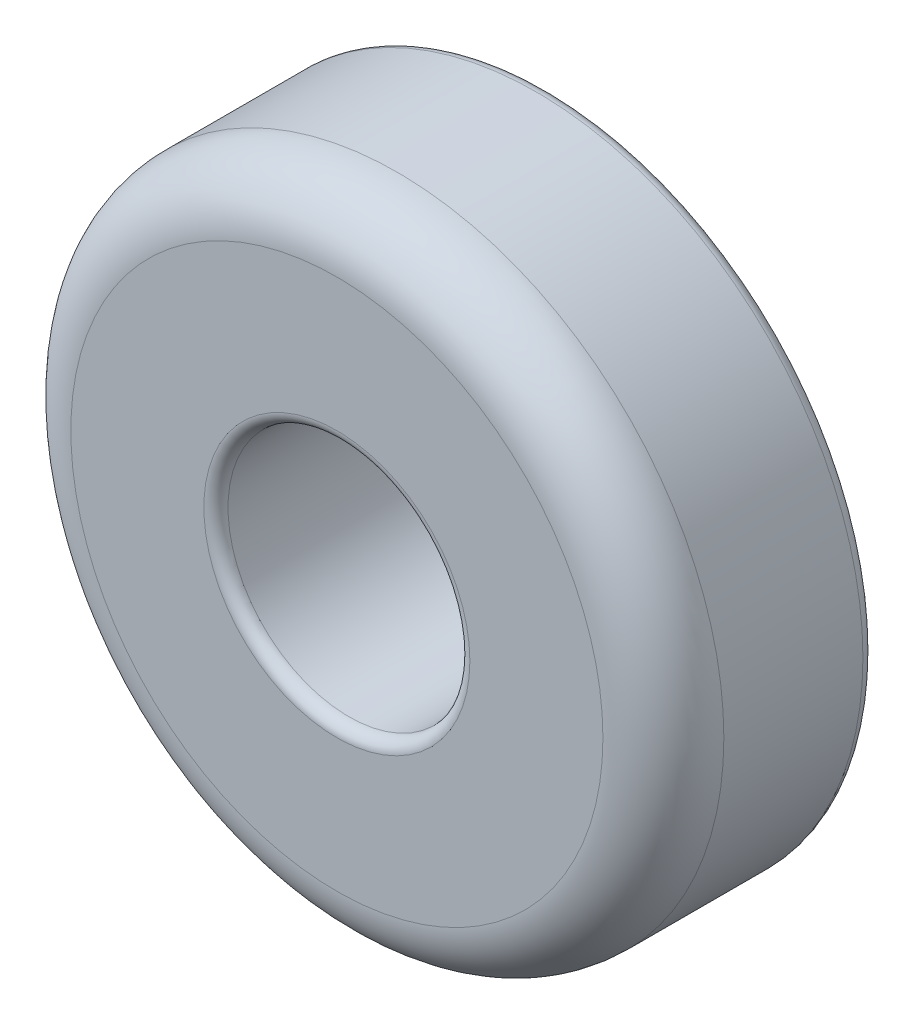
ISO-10303-21;
HEADER;
FILE_DESCRIPTION(('STEP AP214'),'2;1');
FILE_NAME('part.step','',(''),(''),'','','');
FILE_SCHEMA(('AUTOMOTIVE_DESIGN { 1 0 10303 214 1 1 1 1 }'));
ENDSEC;
DATA;
#1=APPLICATION_CONTEXT('core data for automotive mechanical design processes');
#2=APPLICATION_PROTOCOL_DEFINITION('international standard','automotive_design',2000,#1);
#3=PRODUCT_CONTEXT('',#1,'mechanical');
#4=PRODUCT('Part','Part','',(#3));
#5=PRODUCT_RELATED_PRODUCT_CATEGORY('part','',(#4));
#6=PRODUCT_DEFINITION_FORMATION('','',#4);
#7=PRODUCT_DEFINITION_CONTEXT('part definition',#1,'design');
#8=PRODUCT_DEFINITION('design','',#6,#7);
#9=PRODUCT_DEFINITION_SHAPE('','',#8);
#10=(LENGTH_UNIT() NAMED_UNIT(*) SI_UNIT(.MILLI.,.METRE.));
#11=(NAMED_UNIT(*) PLANE_ANGLE_UNIT() SI_UNIT($,.RADIAN.));
#12=(NAMED_UNIT(*) SI_UNIT($,.STERADIAN.) SOLID_ANGLE_UNIT());
#13=UNCERTAINTY_MEASURE_WITH_UNIT(LENGTH_MEASURE(1.E-05),#10,'distance_accuracy_value','');
#14=(GEOMETRIC_REPRESENTATION_CONTEXT(3) GLOBAL_UNCERTAINTY_ASSIGNED_CONTEXT((#13)) GLOBAL_UNIT_ASSIGNED_CONTEXT((#10,
#11,#12)) REPRESENTATION_CONTEXT('',''));
#15=CARTESIAN_POINT('',(0.,0.,0.));
#16=DIRECTION('',(0.,0.,1.));
#17=DIRECTION('',(1.,0.,0.));
#18=AXIS2_PLACEMENT_3D('',#15,#16,#17);
#19=CARTESIAN_POINT('',(0.,0.,1.75));
#20=DIRECTION('',(0.,0.,1.));
#21=DIRECTION('',(1.,0.,0.));
#22=AXIS2_PLACEMENT_3D('',#19,#20,#21);
#23=PLANE('',#22);
#24=CARTESIAN_POINT('',(0.,0.,1.75));
#25=DIRECTION('',(0.,0.,1.));
#26=DIRECTION('',(1.,0.,0.));
#27=AXIS2_PLACEMENT_3D('',#24,#25,#26);
#28=CIRCLE('',#27,1.1);
#29=CARTESIAN_POINT('',(1.1,0.,1.75));
#30=VERTEX_POINT('',#29);
#31=EDGE_CURVE('E47',#30,#30,#28,.F.);
#32=ORIENTED_EDGE('',*,*,#31,.T.);
#33=EDGE_LOOP('',(#32));
#34=FACE_BOUND('',#33,.T.);
#35=CARTESIAN_POINT('',(0.,0.,1.75));
#36=DIRECTION('',(0.,0.,1.));
#37=DIRECTION('',(1.,0.,0.));
#38=AXIS2_PLACEMENT_3D('',#35,#36,#37);
#39=CIRCLE('',#38,2.2);
#40=CARTESIAN_POINT('',(2.2,0.,1.75));
#41=VERTEX_POINT('',#40);
#42=EDGE_CURVE('E59',#41,#41,#39,.T.);
#43=ORIENTED_EDGE('',*,*,#42,.T.);
#44=EDGE_LOOP('',(#43));
#45=FACE_BOUND('',#44,.T.);
#46=ADVANCED_FACE('F36',(#34,#45),#23,.T.);
#47=CARTESIAN_POINT('',(0.,0.,0.));
#48=DIRECTION('',(0.,0.,1.));
#49=DIRECTION('',(1.,0.,0.));
#50=AXIS2_PLACEMENT_3D('',#47,#48,#49);
#51=PLANE('',#50);
#52=CARTESIAN_POINT('',(0.,0.,0.));
#53=DIRECTION('',(0.,0.,1.));
#54=DIRECTION('',(1.,0.,0.));
#55=AXIS2_PLACEMENT_3D('',#52,#53,#54);
#56=CIRCLE('',#55,2.6);
#57=CARTESIAN_POINT('',(2.6,0.,0.));
#58=VERTEX_POINT('',#57);
#59=EDGE_CURVE('E11',#58,#58,#56,.F.);
#60=ORIENTED_EDGE('',*,*,#59,.T.);
#61=EDGE_LOOP('',(#60));
#62=FACE_BOUND('',#61,.T.);
#63=CARTESIAN_POINT('',(0.,0.,0.));
#64=DIRECTION('',(0.,0.,1.));
#65=DIRECTION('',(1.,0.,0.));
#66=AXIS2_PLACEMENT_3D('',#63,#64,#65);
#67=CIRCLE('',#66,1.);
#68=CARTESIAN_POINT('',(1.,0.,0.));
#69=VERTEX_POINT('',#68);
#70=EDGE_CURVE('E62',#69,#69,#67,.T.);
#71=ORIENTED_EDGE('',*,*,#70,.T.);
#72=EDGE_LOOP('',(#71));
#73=FACE_BOUND('',#72,.T.);
#74=ADVANCED_FACE('F66',(#62,#73),#51,.F.);
#75=CARTESIAN_POINT('',(0.,0.,1.75));
#76=DIRECTION('',(0.,0.,-1.));
#77=DIRECTION('',(-1.,0.,0.));
#78=AXIS2_PLACEMENT_3D('',#75,#76,#77);
#79=CYLINDRICAL_SURFACE('',#78,2.7);
#80=CARTESIAN_POINT('',(0.,0.,0.1));
#81=DIRECTION('',(0.,0.,1.));
#82=DIRECTION('',(1.,0.,0.));
#83=AXIS2_PLACEMENT_3D('',#80,#81,#82);
#84=CIRCLE('',#83,2.7);
#85=CARTESIAN_POINT('',(2.7,0.,0.1));
#86=VERTEX_POINT('',#85);
#87=EDGE_CURVE('E43',#86,#86,#84,.T.);
#88=ORIENTED_EDGE('',*,*,#87,.T.);
#89=EDGE_LOOP('',(#88));
#90=FACE_BOUND('',#89,.T.);
#91=CARTESIAN_POINT('',(0.,0.,1.25));
#92=DIRECTION('',(0.,0.,1.));
#93=DIRECTION('',(1.,0.,0.));
#94=AXIS2_PLACEMENT_3D('',#91,#92,#93);
#95=CIRCLE('',#94,2.7);
#96=CARTESIAN_POINT('',(2.7,0.,1.25));
#97=VERTEX_POINT('',#96);
#98=EDGE_CURVE('E56',#97,#97,#95,.F.);
#99=ORIENTED_EDGE('',*,*,#98,.T.);
#100=EDGE_LOOP('',(#99));
#101=FACE_BOUND('',#100,.T.);
#102=ADVANCED_FACE('F71',(#90,#101),#79,.T.);
#103=CARTESIAN_POINT('',(0.,0.,1.75));
#104=DIRECTION('',(0.,0.,-1.));
#105=DIRECTION('',(-1.,0.,0.));
#106=AXIS2_PLACEMENT_3D('',#103,#104,#105);
#107=CYLINDRICAL_SURFACE('',#106,1.);
#108=CARTESIAN_POINT('',(0.,0.,1.65));
#109=DIRECTION('',(0.,0.,1.));
#110=DIRECTION('',(1.,0.,0.));
#111=AXIS2_PLACEMENT_3D('',#108,#109,#110);
#112=CIRCLE('',#111,1.);
#113=CARTESIAN_POINT('',(1.,0.,1.65));
#114=VERTEX_POINT('',#113);
#115=EDGE_CURVE('E51',#114,#114,#112,.T.);
#116=ORIENTED_EDGE('',*,*,#115,.T.);
#117=EDGE_LOOP('',(#116));
#118=FACE_BOUND('',#117,.T.);
#119=ORIENTED_EDGE('',*,*,#70,.F.);
#120=EDGE_LOOP('',(#119));
#121=FACE_BOUND('',#120,.T.);
#122=ADVANCED_FACE('F68',(#118,#121),#107,.F.);
#123=CARTESIAN_POINT('',(0.,0.,1.25));
#124=DIRECTION('',(0.,0.,1.));
#125=DIRECTION('',(1.,0.,0.));
#126=AXIS2_PLACEMENT_3D('',#123,#124,#125);
#127=TOROIDAL_SURFACE('',#126,2.2,0.5);
#128=ORIENTED_EDGE('',*,*,#98,.F.);
#129=EDGE_LOOP('',(#128));
#130=FACE_BOUND('',#129,.T.);
#131=ORIENTED_EDGE('',*,*,#42,.F.);
#132=EDGE_LOOP('',(#131));
#133=FACE_BOUND('',#132,.T.);
#134=ADVANCED_FACE('F70',(#130,#133),#127,.T.);
#135=CARTESIAN_POINT('',(0.,0.,1.65));
#136=DIRECTION('',(0.,0.,1.));
#137=DIRECTION('',(1.,0.,0.));
#138=AXIS2_PLACEMENT_3D('',#135,#136,#137);
#139=TOROIDAL_SURFACE('',#138,1.1,0.1);
#140=ORIENTED_EDGE('',*,*,#31,.F.);
#141=EDGE_LOOP('',(#140));
#142=FACE_BOUND('',#141,.T.);
#143=ORIENTED_EDGE('',*,*,#115,.F.);
#144=EDGE_LOOP('',(#143));
#145=FACE_BOUND('',#144,.T.);
#146=ADVANCED_FACE('F78',(#142,#145),#139,.T.);
#147=CARTESIAN_POINT('',(0.,0.,0.1));
#148=DIRECTION('',(0.,0.,1.));
#149=DIRECTION('',(1.,0.,0.));
#150=AXIS2_PLACEMENT_3D('',#147,#148,#149);
#151=TOROIDAL_SURFACE('',#150,2.6,0.1);
#152=ORIENTED_EDGE('',*,*,#59,.F.);
#153=EDGE_LOOP('',(#152));
#154=FACE_BOUND('',#153,.T.);
#155=ORIENTED_EDGE('',*,*,#87,.F.);
#156=EDGE_LOOP('',(#155));
#157=FACE_BOUND('',#156,.T.);
#158=ADVANCED_FACE('F38',(#154,#157),#151,.T.);
#159=CLOSED_SHELL('',(#46,#74,#102,#122,#134,#146,#158));
#160=MANIFOLD_SOLID_BREP('B2',#159);
#161=ADVANCED_BREP_SHAPE_REPRESENTATION('',(#18,#160),#14);
#162=SHAPE_DEFINITION_REPRESENTATION(#9,#161);
ENDSEC;
END-ISO-10303-21;
